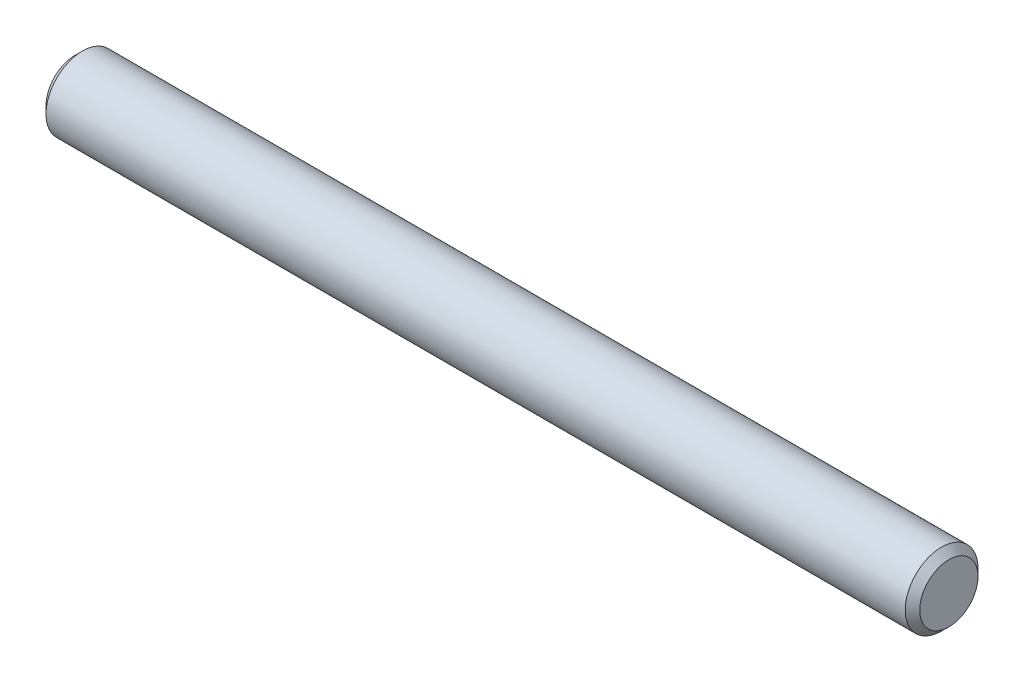
ISO-10303-21;
HEADER;
FILE_DESCRIPTION(('STEP AP214'),'2;1');
FILE_NAME('part.step','',(''),(''),'','','');
FILE_SCHEMA(('AUTOMOTIVE_DESIGN { 1 0 10303 214 1 1 1 1 }'));
ENDSEC;
DATA;
#1=APPLICATION_CONTEXT('core data for automotive mechanical design processes');
#2=APPLICATION_PROTOCOL_DEFINITION('international standard','automotive_design',2000,#1);
#3=PRODUCT_CONTEXT('',#1,'mechanical');
#4=PRODUCT('Part','Part','',(#3));
#5=PRODUCT_RELATED_PRODUCT_CATEGORY('part','',(#4));
#6=PRODUCT_DEFINITION_FORMATION('','',#4);
#7=PRODUCT_DEFINITION_CONTEXT('part definition',#1,'design');
#8=PRODUCT_DEFINITION('design','',#6,#7);
#9=PRODUCT_DEFINITION_SHAPE('','',#8);
#10=(LENGTH_UNIT() NAMED_UNIT(*) SI_UNIT(.MILLI.,.METRE.));
#11=(NAMED_UNIT(*) PLANE_ANGLE_UNIT() SI_UNIT($,.RADIAN.));
#12=(NAMED_UNIT(*) SI_UNIT($,.STERADIAN.) SOLID_ANGLE_UNIT());
#13=UNCERTAINTY_MEASURE_WITH_UNIT(LENGTH_MEASURE(1.E-05),#10,'distance_accuracy_value','');
#14=(GEOMETRIC_REPRESENTATION_CONTEXT(3) GLOBAL_UNCERTAINTY_ASSIGNED_CONTEXT((#13)) GLOBAL_UNIT_ASSIGNED_CONTEXT((#10,
#11,#12)) REPRESENTATION_CONTEXT('',''));
#15=CARTESIAN_POINT('',(0.,0.,0.));
#16=DIRECTION('',(0.,0.,1.));
#17=DIRECTION('',(1.,0.,0.));
#18=AXIS2_PLACEMENT_3D('',#15,#16,#17);
#19=CARTESIAN_POINT('',(-38.1,0.,0.));
#20=DIRECTION('',(1.,0.,0.));
#21=DIRECTION('',(0.,0.,-1.));
#22=AXIS2_PLACEMENT_3D('',#19,#20,#21);
#23=CYLINDRICAL_SURFACE('',#22,3.175);
#24=CARTESIAN_POINT('',(37.465,0.,0.));
#25=DIRECTION('',(1.,0.,0.));
#26=DIRECTION('',(0.,0.,-1.));
#27=AXIS2_PLACEMENT_3D('',#24,#25,#26);
#28=CIRCLE('',#27,3.175);
#29=CARTESIAN_POINT('',(37.465,0.,-3.175));
#30=VERTEX_POINT('',#29);
#31=EDGE_CURVE('E39',#30,#30,#28,.F.);
#32=ORIENTED_EDGE('',*,*,#31,.T.);
#33=EDGE_LOOP('',(#32));
#34=FACE_BOUND('',#33,.T.);
#35=CARTESIAN_POINT('',(-37.465,0.,0.));
#36=DIRECTION('',(1.,0.,0.));
#37=DIRECTION('',(0.,0.,-1.));
#38=AXIS2_PLACEMENT_3D('',#35,#36,#37);
#39=CIRCLE('',#38,3.175);
#40=CARTESIAN_POINT('',(-37.465,0.,-3.175));
#41=VERTEX_POINT('',#40);
#42=EDGE_CURVE('E43',#41,#41,#39,.T.);
#43=ORIENTED_EDGE('',*,*,#42,.T.);
#44=EDGE_LOOP('',(#43));
#45=FACE_BOUND('',#44,.T.);
#46=ADVANCED_FACE('F32',(#34,#45),#23,.T.);
#47=CARTESIAN_POINT('',(-38.1,0.,0.));
#48=DIRECTION('',(1.,0.,0.));
#49=DIRECTION('',(0.,0.,-1.));
#50=AXIS2_PLACEMENT_3D('',#47,#48,#49);
#51=PLANE('',#50);
#52=CARTESIAN_POINT('',(-38.1,0.,0.));
#53=DIRECTION('',(1.,0.,0.));
#54=DIRECTION('',(0.,0.,-1.));
#55=AXIS2_PLACEMENT_3D('',#52,#53,#54);
#56=CIRCLE('',#55,2.53999999999999);
#57=CARTESIAN_POINT('',(-38.1,0.,-2.53999999999999));
#58=VERTEX_POINT('',#57);
#59=EDGE_CURVE('E10',#58,#58,#56,.F.);
#60=ORIENTED_EDGE('',*,*,#59,.T.);
#61=EDGE_LOOP('',(#60));
#62=FACE_BOUND('',#61,.T.);
#63=ADVANCED_FACE('F63',(#62),#51,.F.);
#64=CARTESIAN_POINT('',(38.1,0.,0.));
#65=DIRECTION('',(1.,0.,0.));
#66=DIRECTION('',(0.,0.,-1.));
#67=AXIS2_PLACEMENT_3D('',#64,#65,#66);
#68=PLANE('',#67);
#69=CARTESIAN_POINT('',(38.1,0.,0.));
#70=DIRECTION('',(1.,0.,0.));
#71=DIRECTION('',(0.,0.,-1.));
#72=AXIS2_PLACEMENT_3D('',#69,#70,#71);
#73=CIRCLE('',#72,2.53999999999999);
#74=CARTESIAN_POINT('',(38.1,0.,-2.53999999999999));
#75=VERTEX_POINT('',#74);
#76=EDGE_CURVE('E47',#75,#75,#73,.T.);
#77=ORIENTED_EDGE('',*,*,#76,.T.);
#78=EDGE_LOOP('',(#77));
#79=FACE_BOUND('',#78,.T.);
#80=ADVANCED_FACE('F53',(#79),#68,.T.);
#81=CARTESIAN_POINT('',(38.1,0.,0.));
#82=DIRECTION('',(-1.,0.,0.));
#83=DIRECTION('',(0.,0.,1.));
#84=AXIS2_PLACEMENT_3D('',#81,#82,#83);
#85=CONICAL_SURFACE('',#84,2.53999999999999,0.785398163397446);
#86=ORIENTED_EDGE('',*,*,#31,.F.);
#87=EDGE_LOOP('',(#86));
#88=FACE_BOUND('',#87,.T.);
#89=ORIENTED_EDGE('',*,*,#76,.F.);
#90=EDGE_LOOP('',(#89));
#91=FACE_BOUND('',#90,.T.);
#92=ADVANCED_FACE('F55',(#88,#91),#85,.T.);
#93=CARTESIAN_POINT('',(-37.465,0.,0.));
#94=DIRECTION('',(1.,0.,0.));
#95=DIRECTION('',(0.,0.,-1.));
#96=AXIS2_PLACEMENT_3D('',#93,#94,#95);
#97=CONICAL_SURFACE('',#96,3.175,0.785398163397446);
#98=ORIENTED_EDGE('',*,*,#59,.F.);
#99=EDGE_LOOP('',(#98));
#100=FACE_BOUND('',#99,.T.);
#101=ORIENTED_EDGE('',*,*,#42,.F.);
#102=EDGE_LOOP('',(#101));
#103=FACE_BOUND('',#102,.T.);
#104=ADVANCED_FACE('F34',(#100,#103),#97,.T.);
#105=CLOSED_SHELL('',(#46,#63,#80,#92,#104));
#106=MANIFOLD_SOLID_BREP('B2',#105);
#107=ADVANCED_BREP_SHAPE_REPRESENTATION('',(#18,#106),#14);
#108=SHAPE_DEFINITION_REPRESENTATION(#9,#107);
ENDSEC;
END-ISO-10303-21;
